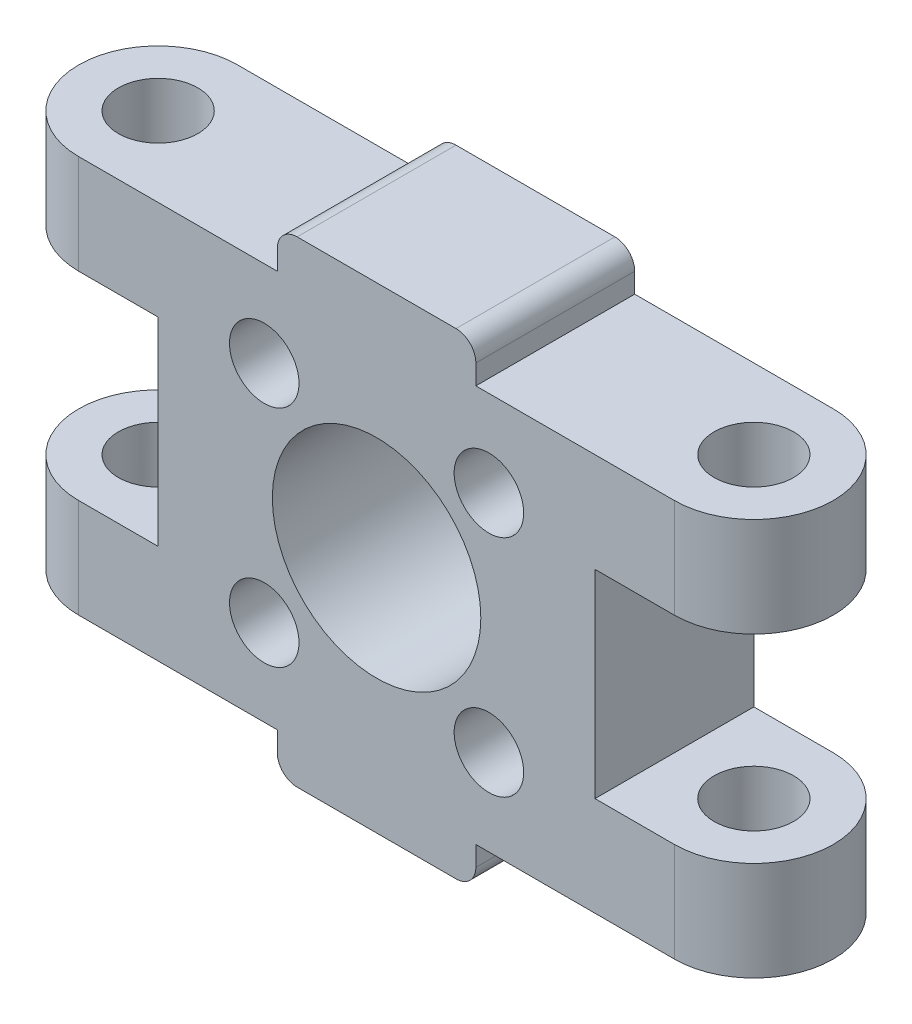
ISO-10303-21;
HEADER;
FILE_DESCRIPTION(('STEP AP214'),'2;1');
FILE_NAME('part.step','',(''),(''),'','','');
FILE_SCHEMA(('AUTOMOTIVE_DESIGN { 1 0 10303 214 1 1 1 1 }'));
ENDSEC;
DATA;
#1=APPLICATION_CONTEXT('core data for automotive mechanical design processes');
#2=APPLICATION_PROTOCOL_DEFINITION('international standard','automotive_design',2000,#1);
#3=PRODUCT_CONTEXT('',#1,'mechanical');
#4=PRODUCT('Part','Part','',(#3));
#5=PRODUCT_RELATED_PRODUCT_CATEGORY('part','',(#4));
#6=PRODUCT_DEFINITION_FORMATION('','',#4);
#7=PRODUCT_DEFINITION_CONTEXT('part definition',#1,'design');
#8=PRODUCT_DEFINITION('design','',#6,#7);
#9=PRODUCT_DEFINITION_SHAPE('','',#8);
#10=(LENGTH_UNIT() NAMED_UNIT(*) SI_UNIT(.MILLI.,.METRE.));
#11=(NAMED_UNIT(*) PLANE_ANGLE_UNIT() SI_UNIT($,.RADIAN.));
#12=(NAMED_UNIT(*) SI_UNIT($,.STERADIAN.) SOLID_ANGLE_UNIT());
#13=UNCERTAINTY_MEASURE_WITH_UNIT(LENGTH_MEASURE(1.E-05),#10,'distance_accuracy_value','');
#14=(GEOMETRIC_REPRESENTATION_CONTEXT(3) GLOBAL_UNCERTAINTY_ASSIGNED_CONTEXT((#13)) GLOBAL_UNIT_ASSIGNED_CONTEXT((#10,
#11,#12)) REPRESENTATION_CONTEXT('',''));
#15=CARTESIAN_POINT('',(0.,0.,0.));
#16=DIRECTION('',(0.,0.,1.));
#17=DIRECTION('',(1.,0.,0.));
#18=AXIS2_PLACEMENT_3D('',#15,#16,#17);
#19=CARTESIAN_POINT('',(15.,10.,3.99999999999999));
#20=DIRECTION('',(0.,0.,-1.));
#21=DIRECTION('',(-1.,0.,0.));
#22=AXIS2_PLACEMENT_3D('',#19,#20,#21);
#23=PLANE('',#22);
#24=CARTESIAN_POINT('',(5.65685424949235,-5.65685424949241,4.));
#25=DIRECTION('',(0.,0.,1.));
#26=DIRECTION('',(1.,0.,0.));
#27=AXIS2_PLACEMENT_3D('',#24,#25,#26);
#28=CIRCLE('',#27,1.75);
#29=CARTESIAN_POINT('',(7.40685424949235,-5.65685424949241,4.));
#30=VERTEX_POINT('',#29);
#31=EDGE_CURVE('E433',#30,#30,#28,.T.);
#32=ORIENTED_EDGE('',*,*,#31,.F.);
#33=EDGE_LOOP('',(#32));
#34=FACE_BOUND('',#33,.T.);
#35=CARTESIAN_POINT('',(-5.65685424949235,-5.65685424949241,4.));
#36=DIRECTION('',(0.,0.,1.));
#37=DIRECTION('',(1.,0.,0.));
#38=AXIS2_PLACEMENT_3D('',#35,#36,#37);
#39=CIRCLE('',#38,1.75);
#40=CARTESIAN_POINT('',(-3.90685424949235,-5.65685424949241,4.));
#41=VERTEX_POINT('',#40);
#42=EDGE_CURVE('E421',#41,#41,#39,.T.);
#43=ORIENTED_EDGE('',*,*,#42,.F.);
#44=EDGE_LOOP('',(#43));
#45=FACE_BOUND('',#44,.T.);
#46=DIRECTION('',(0.,-1.,0.));
#47=VECTOR('',#46,1.);
#48=CARTESIAN_POINT('',(-5.,-9.79795897113271,4.));
#49=LINE('',#48,#47);
#50=CARTESIAN_POINT('',(-5.,-10.,4.));
#51=VERTEX_POINT('',#50);
#52=CARTESIAN_POINT('',(-5.,-11.,4.));
#53=VERTEX_POINT('',#52);
#54=EDGE_CURVE('E234',#51,#53,#49,.T.);
#55=ORIENTED_EDGE('',*,*,#54,.T.);
#56=CARTESIAN_POINT('',(-4.,-11.,4.));
#57=DIRECTION('',(0.,0.,-1.));
#58=DIRECTION('',(-1.,0.,0.));
#59=AXIS2_PLACEMENT_3D('',#56,#57,#58);
#60=CIRCLE('',#59,1.);
#61=CARTESIAN_POINT('',(-4.,-12.,4.));
#62=VERTEX_POINT('',#61);
#63=EDGE_CURVE('E374',#53,#62,#60,.F.);
#64=ORIENTED_EDGE('',*,*,#63,.T.);
#65=DIRECTION('',(1.,0.,0.));
#66=VECTOR('',#65,1.);
#67=CARTESIAN_POINT('',(5.,-12.,4.));
#68=LINE('',#67,#66);
#69=CARTESIAN_POINT('',(4.,-12.,4.));
#70=VERTEX_POINT('',#69);
#71=EDGE_CURVE('E237',#62,#70,#68,.T.);
#72=ORIENTED_EDGE('',*,*,#71,.T.);
#73=CARTESIAN_POINT('',(4.,-11.,4.));
#74=DIRECTION('',(0.,0.,-1.));
#75=DIRECTION('',(-1.,0.,0.));
#76=AXIS2_PLACEMENT_3D('',#73,#74,#75);
#77=CIRCLE('',#76,1.);
#78=CARTESIAN_POINT('',(5.,-11.,4.));
#79=VERTEX_POINT('',#78);
#80=EDGE_CURVE('E372',#70,#79,#77,.F.);
#81=ORIENTED_EDGE('',*,*,#80,.T.);
#82=DIRECTION('',(0.,1.,0.));
#83=VECTOR('',#82,1.);
#84=CARTESIAN_POINT('',(5.,-9.79795897113271,4.));
#85=LINE('',#84,#83);
#86=CARTESIAN_POINT('',(5.,-10.,4.));
#87=VERTEX_POINT('',#86);
#88=EDGE_CURVE('E241',#79,#87,#85,.T.);
#89=ORIENTED_EDGE('',*,*,#88,.T.);
#90=DIRECTION('',(1.,0.,0.));
#91=VECTOR('',#90,1.);
#92=CARTESIAN_POINT('',(15.,-10.,3.99999999999999));
#93=LINE('',#92,#91);
#94=CARTESIAN_POINT('',(15.,-10.,3.99999999999999));
#95=VERTEX_POINT('',#94);
#96=EDGE_CURVE('E334',#87,#95,#93,.T.);
#97=ORIENTED_EDGE('',*,*,#96,.T.);
#98=DIRECTION('',(0.,-1.,0.));
#99=VECTOR('',#98,1.);
#100=CARTESIAN_POINT('',(15.,10.,3.99999999999999));
#101=LINE('',#100,#99);
#102=CARTESIAN_POINT('',(15.,-5.,4.));
#103=VERTEX_POINT('',#102);
#104=EDGE_CURVE('E349',#103,#95,#101,.T.);
#105=ORIENTED_EDGE('',*,*,#104,.F.);
#106=DIRECTION('',(1.,0.,0.));
#107=VECTOR('',#106,1.);
#108=CARTESIAN_POINT('',(19.,-5.,4.));
#109=LINE('',#108,#107);
#110=CARTESIAN_POINT('',(11.,-5.,4.));
#111=VERTEX_POINT('',#110);
#112=EDGE_CURVE('E270',#111,#103,#109,.T.);
#113=ORIENTED_EDGE('',*,*,#112,.F.);
#114=DIRECTION('',(0.,-1.,0.));
#115=VECTOR('',#114,1.);
#116=CARTESIAN_POINT('',(11.,5.,4.));
#117=LINE('',#116,#115);
#118=CARTESIAN_POINT('',(11.,5.,4.));
#119=VERTEX_POINT('',#118);
#120=EDGE_CURVE('E268',#119,#111,#117,.T.);
#121=ORIENTED_EDGE('',*,*,#120,.F.);
#122=DIRECTION('',(-1.,0.,0.));
#123=VECTOR('',#122,1.);
#124=CARTESIAN_POINT('',(19.,5.,4.));
#125=LINE('',#124,#123);
#126=CARTESIAN_POINT('',(15.,5.,4.));
#127=VERTEX_POINT('',#126);
#128=EDGE_CURVE('E220',#127,#119,#125,.T.);
#129=ORIENTED_EDGE('',*,*,#128,.F.);
#130=CARTESIAN_POINT('',(15.,10.,3.99999999999999));
#131=VERTEX_POINT('',#130);
#132=EDGE_CURVE('E350',#131,#127,#101,.T.);
#133=ORIENTED_EDGE('',*,*,#132,.F.);
#134=DIRECTION('',(1.,0.,0.));
#135=VECTOR('',#134,1.);
#136=CARTESIAN_POINT('',(15.,10.,3.99999999999999));
#137=LINE('',#136,#135);
#138=CARTESIAN_POINT('',(5.,10.,4.));
#139=VERTEX_POINT('',#138);
#140=EDGE_CURVE('E326',#139,#131,#137,.T.);
#141=ORIENTED_EDGE('',*,*,#140,.F.);
#142=DIRECTION('',(0.,1.,0.));
#143=VECTOR('',#142,1.);
#144=CARTESIAN_POINT('',(5.,12.,4.));
#145=LINE('',#144,#143);
#146=CARTESIAN_POINT('',(5.,11.,4.));
#147=VERTEX_POINT('',#146);
#148=EDGE_CURVE('E243',#139,#147,#145,.T.);
#149=ORIENTED_EDGE('',*,*,#148,.T.);
#150=CARTESIAN_POINT('',(4.,11.,4.));
#151=DIRECTION('',(0.,0.,-1.));
#152=DIRECTION('',(-1.,0.,0.));
#153=AXIS2_PLACEMENT_3D('',#150,#151,#152);
#154=CIRCLE('',#153,1.);
#155=CARTESIAN_POINT('',(4.,12.,4.));
#156=VERTEX_POINT('',#155);
#157=EDGE_CURVE('E368',#147,#156,#154,.F.);
#158=ORIENTED_EDGE('',*,*,#157,.T.);
#159=DIRECTION('',(-1.,0.,0.));
#160=VECTOR('',#159,1.);
#161=CARTESIAN_POINT('',(5.,12.,4.));
#162=LINE('',#161,#160);
#163=CARTESIAN_POINT('',(-4.,12.,4.));
#164=VERTEX_POINT('',#163);
#165=EDGE_CURVE('E246',#156,#164,#162,.T.);
#166=ORIENTED_EDGE('',*,*,#165,.T.);
#167=CARTESIAN_POINT('',(-4.,11.,4.));
#168=DIRECTION('',(0.,0.,-1.));
#169=DIRECTION('',(-1.,0.,0.));
#170=AXIS2_PLACEMENT_3D('',#167,#168,#169);
#171=CIRCLE('',#170,1.);
#172=CARTESIAN_POINT('',(-5.,11.,4.));
#173=VERTEX_POINT('',#172);
#174=EDGE_CURVE('E370',#164,#173,#171,.F.);
#175=ORIENTED_EDGE('',*,*,#174,.T.);
#176=DIRECTION('',(0.,-1.,0.));
#177=VECTOR('',#176,1.);
#178=CARTESIAN_POINT('',(-5.,12.,4.));
#179=LINE('',#178,#177);
#180=CARTESIAN_POINT('',(-5.,10.,4.));
#181=VERTEX_POINT('',#180);
#182=EDGE_CURVE('E249',#173,#181,#179,.T.);
#183=ORIENTED_EDGE('',*,*,#182,.T.);
#184=CARTESIAN_POINT('',(-15.,10.,4.));
#185=VERTEX_POINT('',#184);
#186=EDGE_CURVE('E217',#185,#181,#137,.T.);
#187=ORIENTED_EDGE('',*,*,#186,.F.);
#188=DIRECTION('',(0.,-1.,0.));
#189=VECTOR('',#188,1.);
#190=CARTESIAN_POINT('',(-15.,10.,4.));
#191=LINE('',#190,#189);
#192=CARTESIAN_POINT('',(-15.,5.,4.));
#193=VERTEX_POINT('',#192);
#194=EDGE_CURVE('E354',#185,#193,#191,.T.);
#195=ORIENTED_EDGE('',*,*,#194,.T.);
#196=DIRECTION('',(-1.,0.,0.));
#197=VECTOR('',#196,1.);
#198=CARTESIAN_POINT('',(-19.,5.,4.));
#199=LINE('',#198,#197);
#200=CARTESIAN_POINT('',(-11.,5.,4.));
#201=VERTEX_POINT('',#200);
#202=EDGE_CURVE('E295',#201,#193,#199,.T.);
#203=ORIENTED_EDGE('',*,*,#202,.F.);
#204=DIRECTION('',(0.,1.,0.));
#205=VECTOR('',#204,1.);
#206=CARTESIAN_POINT('',(-11.,5.,4.));
#207=LINE('',#206,#205);
#208=CARTESIAN_POINT('',(-11.,-5.,4.));
#209=VERTEX_POINT('',#208);
#210=EDGE_CURVE('E293',#209,#201,#207,.T.);
#211=ORIENTED_EDGE('',*,*,#210,.F.);
#212=DIRECTION('',(1.,0.,0.));
#213=VECTOR('',#212,1.);
#214=CARTESIAN_POINT('',(-19.,-5.,4.));
#215=LINE('',#214,#213);
#216=CARTESIAN_POINT('',(-15.,-5.,4.));
#217=VERTEX_POINT('',#216);
#218=EDGE_CURVE('E285',#217,#209,#215,.T.);
#219=ORIENTED_EDGE('',*,*,#218,.F.);
#220=CARTESIAN_POINT('',(-15.,-10.,4.));
#221=VERTEX_POINT('',#220);
#222=EDGE_CURVE('E353',#217,#221,#191,.T.);
#223=ORIENTED_EDGE('',*,*,#222,.T.);
#224=EDGE_CURVE('E335',#221,#51,#93,.T.);
#225=ORIENTED_EDGE('',*,*,#224,.T.);
#226=EDGE_LOOP('',(#55,#64,#72,#81,#89,#97,#105,#113,#121,#129,#133,#141,#149,#158,#166,#175,
#183,#187,#195,#203,#211,#219,#223,#225));
#227=FACE_BOUND('',#226,.T.);
#228=CARTESIAN_POINT('',(0.,0.,4.));
#229=DIRECTION('',(0.,0.,1.));
#230=DIRECTION('',(1.,0.,0.));
#231=AXIS2_PLACEMENT_3D('',#228,#229,#230);
#232=CIRCLE('',#231,5.24999999999999);
#233=CARTESIAN_POINT('',(5.24999999999999,0.,4.));
#234=VERTEX_POINT('',#233);
#235=EDGE_CURVE('E415',#234,#234,#232,.T.);
#236=ORIENTED_EDGE('',*,*,#235,.F.);
#237=EDGE_LOOP('',(#236));
#238=FACE_BOUND('',#237,.T.);
#239=CARTESIAN_POINT('',(-5.65685424949235,5.65685424949241,4.));
#240=DIRECTION('',(0.,0.,1.));
#241=DIRECTION('',(1.,0.,0.));
#242=AXIS2_PLACEMENT_3D('',#239,#240,#241);
#243=CIRCLE('',#242,1.75);
#244=CARTESIAN_POINT('',(-3.90685424949235,5.65685424949241,4.));
#245=VERTEX_POINT('',#244);
#246=EDGE_CURVE('E427',#245,#245,#243,.T.);
#247=ORIENTED_EDGE('',*,*,#246,.F.);
#248=EDGE_LOOP('',(#247));
#249=FACE_BOUND('',#248,.T.);
#250=CARTESIAN_POINT('',(5.65685424949235,5.65685424949241,4.));
#251=DIRECTION('',(0.,0.,1.));
#252=DIRECTION('',(1.,0.,0.));
#253=AXIS2_PLACEMENT_3D('',#250,#251,#252);
#254=CIRCLE('',#253,1.75);
#255=CARTESIAN_POINT('',(7.40685424949235,5.65685424949241,4.));
#256=VERTEX_POINT('',#255);
#257=EDGE_CURVE('E439',#256,#256,#254,.T.);
#258=ORIENTED_EDGE('',*,*,#257,.F.);
#259=EDGE_LOOP('',(#258));
#260=FACE_BOUND('',#259,.T.);
#261=ADVANCED_FACE('F34',(#34,#45,#227,#238,#249,#260),#23,.F.);
#262=CARTESIAN_POINT('',(-15.,10.,0.));
#263=DIRECTION('',(0.,1.,0.));
#264=DIRECTION('',(0.,0.,1.));
#265=AXIS2_PLACEMENT_3D('',#262,#263,#264);
#266=PLANE('',#265);
#267=DIRECTION('',(0.,0.,1.));
#268=VECTOR('',#267,1.);
#269=CARTESIAN_POINT('',(-5.,10.,0.));
#270=LINE('',#269,#268);
#271=CARTESIAN_POINT('',(-5.,10.,-4.));
#272=VERTEX_POINT('',#271);
#273=EDGE_CURVE('E214',#272,#181,#270,.T.);
#274=ORIENTED_EDGE('',*,*,#273,.F.);
#275=DIRECTION('',(-1.,0.,0.));
#276=VECTOR('',#275,1.);
#277=CARTESIAN_POINT('',(15.,10.,-4.00000000000001));
#278=LINE('',#277,#276);
#279=CARTESIAN_POINT('',(-15.,10.,-4.));
#280=VERTEX_POINT('',#279);
#281=EDGE_CURVE('E196',#272,#280,#278,.T.);
#282=ORIENTED_EDGE('',*,*,#281,.T.);
#283=CARTESIAN_POINT('',(-15.,10.,0.));
#284=DIRECTION('',(0.,1.,0.));
#285=DIRECTION('',(0.,0.,1.));
#286=AXIS2_PLACEMENT_3D('',#283,#284,#285);
#287=CIRCLE('',#286,4.);
#288=EDGE_CURVE('E324',#280,#185,#287,.T.);
#289=ORIENTED_EDGE('',*,*,#288,.T.);
#290=ORIENTED_EDGE('',*,*,#186,.T.);
#291=EDGE_LOOP('',(#274,#282,#289,#290));
#292=FACE_BOUND('',#291,.T.);
#293=CARTESIAN_POINT('',(-15.,10.,0.));
#294=DIRECTION('',(0.,1.,0.));
#295=DIRECTION('',(0.,0.,1.));
#296=AXIS2_PLACEMENT_3D('',#293,#294,#295);
#297=CIRCLE('',#296,2.);
#298=CARTESIAN_POINT('',(-15.,10.,2.));
#299=VERTEX_POINT('',#298);
#300=EDGE_CURVE('E318',#299,#299,#297,.T.);
#301=ORIENTED_EDGE('',*,*,#300,.F.);
#302=EDGE_LOOP('',(#301));
#303=FACE_BOUND('',#302,.T.);
#304=ADVANCED_FACE('F215',(#292,#303),#266,.T.);
#305=CARTESIAN_POINT('',(-15.,-10.,0.));
#306=DIRECTION('',(0.,1.,0.));
#307=DIRECTION('',(0.,0.,1.));
#308=AXIS2_PLACEMENT_3D('',#305,#306,#307);
#309=PLANE('',#308);
#310=CARTESIAN_POINT('',(15.,-10.,0.));
#311=DIRECTION('',(0.,1.,0.));
#312=DIRECTION('',(0.,0.,1.));
#313=AXIS2_PLACEMENT_3D('',#310,#311,#312);
#314=CIRCLE('',#313,2.);
#315=CARTESIAN_POINT('',(15.,-10.,1.99999999999999));
#316=VERTEX_POINT('',#315);
#317=EDGE_CURVE('E311',#316,#316,#314,.T.);
#318=ORIENTED_EDGE('',*,*,#317,.T.);
#319=EDGE_LOOP('',(#318));
#320=FACE_BOUND('',#319,.T.);
#321=ORIENTED_EDGE('',*,*,#96,.F.);
#322=DIRECTION('',(0.,0.,-1.));
#323=VECTOR('',#322,1.);
#324=CARTESIAN_POINT('',(5.,-10.,0.));
#325=LINE('',#324,#323);
#326=CARTESIAN_POINT('',(5.,-10.,-4.));
#327=VERTEX_POINT('',#326);
#328=EDGE_CURVE('E254',#87,#327,#325,.T.);
#329=ORIENTED_EDGE('',*,*,#328,.T.);
#330=DIRECTION('',(-1.,0.,0.));
#331=VECTOR('',#330,1.);
#332=CARTESIAN_POINT('',(15.,-10.,-4.00000000000001));
#333=LINE('',#332,#331);
#334=CARTESIAN_POINT('',(15.,-10.,-4.00000000000001));
#335=VERTEX_POINT('',#334);
#336=EDGE_CURVE('E327',#335,#327,#333,.T.);
#337=ORIENTED_EDGE('',*,*,#336,.F.);
#338=CARTESIAN_POINT('',(15.,-10.,0.));
#339=DIRECTION('',(0.,1.,0.));
#340=DIRECTION('',(0.,0.,1.));
#341=AXIS2_PLACEMENT_3D('',#338,#339,#340);
#342=CIRCLE('',#341,4.);
#343=EDGE_CURVE('E338',#95,#335,#342,.T.);
#344=ORIENTED_EDGE('',*,*,#343,.F.);
#345=EDGE_LOOP('',(#321,#329,#337,#344));
#346=FACE_BOUND('',#345,.T.);
#347=ADVANCED_FACE('F451',(#320,#346),#309,.F.);
#348=CARTESIAN_POINT('',(15.,10.,0.));
#349=DIRECTION('',(0.,-1.,0.));
#350=DIRECTION('',(0.,0.,-1.));
#351=AXIS2_PLACEMENT_3D('',#348,#349,#350);
#352=CYLINDRICAL_SURFACE('',#351,4.);
#353=ORIENTED_EDGE('',*,*,#132,.T.);
#354=CARTESIAN_POINT('',(15.,5.,0.));
#355=DIRECTION('',(0.,1.,0.));
#356=DIRECTION('',(-1.,0.,0.));
#357=AXIS2_PLACEMENT_3D('',#354,#355,#356);
#358=CIRCLE('',#357,4.);
#359=CARTESIAN_POINT('',(15.,5.,-4.));
#360=VERTEX_POINT('',#359);
#361=EDGE_CURVE('E283',#127,#360,#358,.T.);
#362=ORIENTED_EDGE('',*,*,#361,.T.);
#363=DIRECTION('',(0.,-1.,0.));
#364=VECTOR('',#363,1.);
#365=CARTESIAN_POINT('',(15.,10.,-4.00000000000001));
#366=LINE('',#365,#364);
#367=CARTESIAN_POINT('',(15.,10.,-4.00000000000001));
#368=VERTEX_POINT('',#367);
#369=EDGE_CURVE('E346',#368,#360,#366,.T.);
#370=ORIENTED_EDGE('',*,*,#369,.F.);
#371=CARTESIAN_POINT('',(15.,10.,0.));
#372=DIRECTION('',(0.,1.,0.));
#373=DIRECTION('',(0.,0.,1.));
#374=AXIS2_PLACEMENT_3D('',#371,#372,#373);
#375=CIRCLE('',#374,4.);
#376=EDGE_CURVE('E210',#131,#368,#375,.T.);
#377=ORIENTED_EDGE('',*,*,#376,.F.);
#378=EDGE_LOOP('',(#353,#362,#370,#377));
#379=FACE_BOUND('',#378,.T.);
#380=ADVANCED_FACE('F674',(#379),#352,.T.);
#381=CARTESIAN_POINT('',(15.,10.,0.));
#382=DIRECTION('',(0.,-1.,0.));
#383=DIRECTION('',(0.,0.,-1.));
#384=AXIS2_PLACEMENT_3D('',#381,#382,#383);
#385=CYLINDRICAL_SURFACE('',#384,2.);
#386=CARTESIAN_POINT('',(15.,5.,0.));
#387=DIRECTION('',(0.,1.,0.));
#388=DIRECTION('',(-1.,0.,0.));
#389=AXIS2_PLACEMENT_3D('',#386,#387,#388);
#390=CIRCLE('',#389,2.);
#391=CARTESIAN_POINT('',(13.,5.,0.));
#392=VERTEX_POINT('',#391);
#393=EDGE_CURVE('E282',#392,#392,#390,.T.);
#394=ORIENTED_EDGE('',*,*,#393,.F.);
#395=EDGE_LOOP('',(#394));
#396=FACE_BOUND('',#395,.T.);
#397=CARTESIAN_POINT('',(15.,10.,0.));
#398=DIRECTION('',(0.,1.,0.));
#399=DIRECTION('',(0.,0.,1.));
#400=AXIS2_PLACEMENT_3D('',#397,#398,#399);
#401=CIRCLE('',#400,2.);
#402=CARTESIAN_POINT('',(15.,10.,1.99999999999999));
#403=VERTEX_POINT('',#402);
#404=EDGE_CURVE('E312',#403,#403,#401,.T.);
#405=ORIENTED_EDGE('',*,*,#404,.T.);
#406=EDGE_LOOP('',(#405));
#407=FACE_BOUND('',#406,.T.);
#408=ADVANCED_FACE('F724',(#396,#407),#385,.F.);
#409=CARTESIAN_POINT('',(-15.,10.,0.));
#410=DIRECTION('',(0.,-1.,0.));
#411=DIRECTION('',(0.,0.,-1.));
#412=AXIS2_PLACEMENT_3D('',#409,#410,#411);
#413=CYLINDRICAL_SURFACE('',#412,4.);
#414=DIRECTION('',(0.,-1.,0.));
#415=VECTOR('',#414,1.);
#416=CARTESIAN_POINT('',(-15.,10.,-4.));
#417=LINE('',#416,#415);
#418=CARTESIAN_POINT('',(-15.,5.,-4.));
#419=VERTEX_POINT('',#418);
#420=EDGE_CURVE('E205',#280,#419,#417,.T.);
#421=ORIENTED_EDGE('',*,*,#420,.T.);
#422=CARTESIAN_POINT('',(-15.,5.,0.));
#423=DIRECTION('',(0.,1.,0.));
#424=DIRECTION('',(0.,0.,1.));
#425=AXIS2_PLACEMENT_3D('',#422,#423,#424);
#426=CIRCLE('',#425,4.);
#427=EDGE_CURVE('E309',#419,#193,#426,.T.);
#428=ORIENTED_EDGE('',*,*,#427,.T.);
#429=ORIENTED_EDGE('',*,*,#194,.F.);
#430=ORIENTED_EDGE('',*,*,#288,.F.);
#431=EDGE_LOOP('',(#421,#428,#429,#430));
#432=FACE_BOUND('',#431,.T.);
#433=ADVANCED_FACE('F465',(#432),#413,.T.);
#434=CARTESIAN_POINT('',(-15.,10.,0.));
#435=DIRECTION('',(0.,-1.,0.));
#436=DIRECTION('',(0.,0.,-1.));
#437=AXIS2_PLACEMENT_3D('',#434,#435,#436);
#438=CYLINDRICAL_SURFACE('',#437,2.);
#439=CARTESIAN_POINT('',(-15.,5.,0.));
#440=DIRECTION('',(0.,1.,0.));
#441=DIRECTION('',(0.,0.,1.));
#442=AXIS2_PLACEMENT_3D('',#439,#440,#441);
#443=CIRCLE('',#442,2.);
#444=CARTESIAN_POINT('',(-15.,5.,2.));
#445=VERTEX_POINT('',#444);
#446=EDGE_CURVE('E308',#445,#445,#443,.T.);
#447=ORIENTED_EDGE('',*,*,#446,.F.);
#448=EDGE_LOOP('',(#447));
#449=FACE_BOUND('',#448,.T.);
#450=ORIENTED_EDGE('',*,*,#300,.T.);
#451=EDGE_LOOP('',(#450));
#452=FACE_BOUND('',#451,.T.);
#453=ADVANCED_FACE('F665',(#449,#452),#438,.F.);
#454=DIRECTION('',(0.,0.,-1.));
#455=VECTOR('',#454,1.);
#456=CARTESIAN_POINT('',(5.,10.,0.));
#457=LINE('',#456,#455);
#458=CARTESIAN_POINT('',(5.,10.,-4.));
#459=VERTEX_POINT('',#458);
#460=EDGE_CURVE('E221',#139,#459,#457,.T.);
#461=ORIENTED_EDGE('',*,*,#460,.F.);
#462=ORIENTED_EDGE('',*,*,#140,.T.);
#463=ORIENTED_EDGE('',*,*,#376,.T.);
#464=EDGE_CURVE('E209',#368,#459,#278,.T.);
#465=ORIENTED_EDGE('',*,*,#464,.T.);
#466=EDGE_LOOP('',(#461,#462,#463,#465));
#467=FACE_BOUND('',#466,.T.);
#468=ORIENTED_EDGE('',*,*,#404,.F.);
#469=EDGE_LOOP('',(#468));
#470=FACE_BOUND('',#469,.T.);
#471=ADVANCED_FACE('F453',(#467,#470),#266,.T.);
#472=CARTESIAN_POINT('',(-15.,-10.,0.));
#473=DIRECTION('',(0.,1.,0.));
#474=DIRECTION('',(0.,0.,1.));
#475=AXIS2_PLACEMENT_3D('',#472,#473,#474);
#476=CIRCLE('',#475,2.);
#477=CARTESIAN_POINT('',(-15.,-10.,2.));
#478=VERTEX_POINT('',#477);
#479=EDGE_CURVE('E315',#478,#478,#476,.T.);
#480=ORIENTED_EDGE('',*,*,#479,.T.);
#481=EDGE_LOOP('',(#480));
#482=FACE_BOUND('',#481,.T.);
#483=CARTESIAN_POINT('',(-5.,-10.,-4.));
#484=VERTEX_POINT('',#483);
#485=CARTESIAN_POINT('',(-15.,-10.,-4.));
#486=VERTEX_POINT('',#485);
#487=EDGE_CURVE('E341',#484,#486,#333,.T.);
#488=ORIENTED_EDGE('',*,*,#487,.F.);
#489=DIRECTION('',(0.,0.,1.));
#490=VECTOR('',#489,1.);
#491=CARTESIAN_POINT('',(-5.,-10.,0.));
#492=LINE('',#491,#490);
#493=EDGE_CURVE('E228',#484,#51,#492,.T.);
#494=ORIENTED_EDGE('',*,*,#493,.T.);
#495=ORIENTED_EDGE('',*,*,#224,.F.);
#496=CARTESIAN_POINT('',(-15.,-10.,0.));
#497=DIRECTION('',(0.,1.,0.));
#498=DIRECTION('',(0.,0.,1.));
#499=AXIS2_PLACEMENT_3D('',#496,#497,#498);
#500=CIRCLE('',#499,4.);
#501=EDGE_CURVE('E321',#486,#221,#500,.T.);
#502=ORIENTED_EDGE('',*,*,#501,.F.);
#503=EDGE_LOOP('',(#488,#494,#495,#502));
#504=FACE_BOUND('',#503,.T.);
#505=ADVANCED_FACE('F463',(#482,#504),#309,.F.);
#506=ORIENTED_EDGE('',*,*,#222,.F.);
#507=CARTESIAN_POINT('',(-15.,-5.,0.));
#508=DIRECTION('',(0.,-1.,0.));
#509=DIRECTION('',(0.,0.,-1.));
#510=AXIS2_PLACEMENT_3D('',#507,#508,#509);
#511=CIRCLE('',#510,4.);
#512=CARTESIAN_POINT('',(-15.,-5.,-4.));
#513=VERTEX_POINT('',#512);
#514=EDGE_CURVE('E306',#217,#513,#511,.T.);
#515=ORIENTED_EDGE('',*,*,#514,.T.);
#516=EDGE_CURVE('E331',#513,#486,#417,.T.);
#517=ORIENTED_EDGE('',*,*,#516,.T.);
#518=ORIENTED_EDGE('',*,*,#501,.T.);
#519=EDGE_LOOP('',(#506,#515,#517,#518));
#520=FACE_BOUND('',#519,.T.);
#521=ADVANCED_FACE('F460',(#520),#413,.T.);
#522=CARTESIAN_POINT('',(15.,-5.,0.));
#523=DIRECTION('',(0.,-1.,0.));
#524=DIRECTION('',(1.,0.,0.));
#525=AXIS2_PLACEMENT_3D('',#522,#523,#524);
#526=CIRCLE('',#525,4.);
#527=CARTESIAN_POINT('',(15.,-5.,-4.));
#528=VERTEX_POINT('',#527);
#529=EDGE_CURVE('E280',#528,#103,#526,.T.);
#530=ORIENTED_EDGE('',*,*,#529,.T.);
#531=ORIENTED_EDGE('',*,*,#104,.T.);
#532=ORIENTED_EDGE('',*,*,#343,.T.);
#533=EDGE_CURVE('E345',#528,#335,#366,.T.);
#534=ORIENTED_EDGE('',*,*,#533,.F.);
#535=EDGE_LOOP('',(#530,#531,#532,#534));
#536=FACE_BOUND('',#535,.T.);
#537=ADVANCED_FACE('F458',(#536),#352,.T.);
#538=CARTESIAN_POINT('',(15.,10.,-4.00000000000001));
#539=DIRECTION('',(0.,0.,1.));
#540=DIRECTION('',(1.,0.,0.));
#541=AXIS2_PLACEMENT_3D('',#538,#539,#540);
#542=PLANE('',#541);
#543=CARTESIAN_POINT('',(5.65685424949235,5.65685424949241,-4.));
#544=DIRECTION('',(0.,0.,1.));
#545=DIRECTION('',(1.,0.,0.));
#546=AXIS2_PLACEMENT_3D('',#543,#544,#545);
#547=CIRCLE('',#546,1.75);
#548=CARTESIAN_POINT('',(7.40685424949235,5.65685424949241,-4.));
#549=VERTEX_POINT('',#548);
#550=EDGE_CURVE('E436',#549,#549,#547,.T.);
#551=ORIENTED_EDGE('',*,*,#550,.T.);
#552=EDGE_LOOP('',(#551));
#553=FACE_BOUND('',#552,.T.);
#554=CARTESIAN_POINT('',(5.65685424949235,-5.65685424949241,-4.));
#555=DIRECTION('',(0.,0.,1.));
#556=DIRECTION('',(1.,0.,0.));
#557=AXIS2_PLACEMENT_3D('',#554,#555,#556);
#558=CIRCLE('',#557,1.75);
#559=CARTESIAN_POINT('',(7.40685424949235,-5.65685424949241,-4.));
#560=VERTEX_POINT('',#559);
#561=EDGE_CURVE('E430',#560,#560,#558,.T.);
#562=ORIENTED_EDGE('',*,*,#561,.T.);
#563=EDGE_LOOP('',(#562));
#564=FACE_BOUND('',#563,.T.);
#565=CARTESIAN_POINT('',(-5.65685424949235,5.65685424949241,-4.));
#566=DIRECTION('',(0.,0.,1.));
#567=DIRECTION('',(1.,0.,0.));
#568=AXIS2_PLACEMENT_3D('',#565,#566,#567);
#569=CIRCLE('',#568,1.75);
#570=CARTESIAN_POINT('',(-3.90685424949235,5.65685424949241,-4.));
#571=VERTEX_POINT('',#570);
#572=EDGE_CURVE('E424',#571,#571,#569,.T.);
#573=ORIENTED_EDGE('',*,*,#572,.T.);
#574=EDGE_LOOP('',(#573));
#575=FACE_BOUND('',#574,.T.);
#576=CARTESIAN_POINT('',(-5.65685424949235,-5.65685424949241,-4.));
#577=DIRECTION('',(0.,0.,1.));
#578=DIRECTION('',(1.,0.,0.));
#579=AXIS2_PLACEMENT_3D('',#576,#577,#578);
#580=CIRCLE('',#579,1.75);
#581=CARTESIAN_POINT('',(-3.90685424949235,-5.65685424949241,-4.));
#582=VERTEX_POINT('',#581);
#583=EDGE_CURVE('E418',#582,#582,#580,.T.);
#584=ORIENTED_EDGE('',*,*,#583,.T.);
#585=EDGE_LOOP('',(#584));
#586=FACE_BOUND('',#585,.T.);
#587=CARTESIAN_POINT('',(0.,0.,-4.));
#588=DIRECTION('',(0.,0.,1.));
#589=DIRECTION('',(1.,0.,0.));
#590=AXIS2_PLACEMENT_3D('',#587,#588,#589);
#591=CIRCLE('',#590,5.24999999999999);
#592=CARTESIAN_POINT('',(5.24999999999999,0.,-4.));
#593=VERTEX_POINT('',#592);
#594=EDGE_CURVE('E238',#593,#593,#591,.T.);
#595=ORIENTED_EDGE('',*,*,#594,.T.);
#596=EDGE_LOOP('',(#595));
#597=FACE_BOUND('',#596,.T.);
#598=DIRECTION('',(-1.,0.,0.));
#599=VECTOR('',#598,1.);
#600=CARTESIAN_POINT('',(5.00000000000001,-12.,-4.));
#601=LINE('',#600,#599);
#602=CARTESIAN_POINT('',(4.,-12.,-4.));
#603=VERTEX_POINT('',#602);
#604=CARTESIAN_POINT('',(-4.,-12.,-4.));
#605=VERTEX_POINT('',#604);
#606=EDGE_CURVE('E250',#603,#605,#601,.T.);
#607=ORIENTED_EDGE('',*,*,#606,.T.);
#608=CARTESIAN_POINT('',(-4.,-11.,-4.));
#609=DIRECTION('',(0.,0.,1.));
#610=DIRECTION('',(1.,0.,0.));
#611=AXIS2_PLACEMENT_3D('',#608,#609,#610);
#612=CIRCLE('',#611,1.);
#613=CARTESIAN_POINT('',(-5.,-11.,-4.));
#614=VERTEX_POINT('',#613);
#615=EDGE_CURVE('E386',#605,#614,#612,.F.);
#616=ORIENTED_EDGE('',*,*,#615,.T.);
#617=DIRECTION('',(0.,1.,0.));
#618=VECTOR('',#617,1.);
#619=CARTESIAN_POINT('',(-5.,-9.79795897113271,-4.));
#620=LINE('',#619,#618);
#621=EDGE_CURVE('E225',#614,#484,#620,.T.);
#622=ORIENTED_EDGE('',*,*,#621,.T.);
#623=ORIENTED_EDGE('',*,*,#487,.T.);
#624=ORIENTED_EDGE('',*,*,#516,.F.);
#625=DIRECTION('',(-1.,0.,0.));
#626=VECTOR('',#625,1.);
#627=CARTESIAN_POINT('',(-19.,-5.,-4.));
#628=LINE('',#627,#626);
#629=CARTESIAN_POINT('',(-11.,-5.,-4.));
#630=VERTEX_POINT('',#629);
#631=EDGE_CURVE('E291',#630,#513,#628,.T.);
#632=ORIENTED_EDGE('',*,*,#631,.F.);
#633=DIRECTION('',(0.,-1.,0.));
#634=VECTOR('',#633,1.);
#635=CARTESIAN_POINT('',(-11.,5.,-4.));
#636=LINE('',#635,#634);
#637=CARTESIAN_POINT('',(-11.,5.,-4.));
#638=VERTEX_POINT('',#637);
#639=EDGE_CURVE('E286',#638,#630,#636,.T.);
#640=ORIENTED_EDGE('',*,*,#639,.F.);
#641=DIRECTION('',(1.,0.,0.));
#642=VECTOR('',#641,1.);
#643=CARTESIAN_POINT('',(-19.,5.,-4.));
#644=LINE('',#643,#642);
#645=EDGE_CURVE('E288',#419,#638,#644,.T.);
#646=ORIENTED_EDGE('',*,*,#645,.F.);
#647=ORIENTED_EDGE('',*,*,#420,.F.);
#648=ORIENTED_EDGE('',*,*,#281,.F.);
#649=DIRECTION('',(0.,1.,0.));
#650=VECTOR('',#649,1.);
#651=CARTESIAN_POINT('',(-5.,12.,-4.));
#652=LINE('',#651,#650);
#653=CARTESIAN_POINT('',(-5.,11.,-4.));
#654=VERTEX_POINT('',#653);
#655=EDGE_CURVE('E201',#272,#654,#652,.T.);
#656=ORIENTED_EDGE('',*,*,#655,.T.);
#657=CARTESIAN_POINT('',(-4.,11.,-4.));
#658=DIRECTION('',(0.,0.,1.));
#659=DIRECTION('',(1.,0.,0.));
#660=AXIS2_PLACEMENT_3D('',#657,#658,#659);
#661=CIRCLE('',#660,1.);
#662=CARTESIAN_POINT('',(-4.,12.,-4.));
#663=VERTEX_POINT('',#662);
#664=EDGE_CURVE('E382',#654,#663,#661,.F.);
#665=ORIENTED_EDGE('',*,*,#664,.T.);
#666=DIRECTION('',(1.,0.,0.));
#667=VECTOR('',#666,1.);
#668=CARTESIAN_POINT('',(5.,12.,-4.));
#669=LINE('',#668,#667);
#670=CARTESIAN_POINT('',(4.,12.,-4.));
#671=VERTEX_POINT('',#670);
#672=EDGE_CURVE('E226',#663,#671,#669,.T.);
#673=ORIENTED_EDGE('',*,*,#672,.T.);
#674=CARTESIAN_POINT('',(4.,11.,-4.));
#675=DIRECTION('',(0.,0.,1.));
#676=DIRECTION('',(1.,0.,0.));
#677=AXIS2_PLACEMENT_3D('',#674,#675,#676);
#678=CIRCLE('',#677,1.);
#679=CARTESIAN_POINT('',(5.,11.,-4.));
#680=VERTEX_POINT('',#679);
#681=EDGE_CURVE('E57',#671,#680,#678,.F.);
#682=ORIENTED_EDGE('',*,*,#681,.T.);
#683=DIRECTION('',(0.,-1.,0.));
#684=VECTOR('',#683,1.);
#685=CARTESIAN_POINT('',(5.,12.,-4.));
#686=LINE('',#685,#684);
#687=EDGE_CURVE('E230',#680,#459,#686,.T.);
#688=ORIENTED_EDGE('',*,*,#687,.T.);
#689=ORIENTED_EDGE('',*,*,#464,.F.);
#690=ORIENTED_EDGE('',*,*,#369,.T.);
#691=DIRECTION('',(1.,0.,0.));
#692=VECTOR('',#691,1.);
#693=CARTESIAN_POINT('',(19.,5.,-4.00000000000001));
#694=LINE('',#693,#692);
#695=CARTESIAN_POINT('',(11.,5.,-4.00000000000001));
#696=VERTEX_POINT('',#695);
#697=EDGE_CURVE('E262',#696,#360,#694,.T.);
#698=ORIENTED_EDGE('',*,*,#697,.F.);
#699=DIRECTION('',(0.,1.,0.));
#700=VECTOR('',#699,1.);
#701=CARTESIAN_POINT('',(11.,5.,-4.00000000000001));
#702=LINE('',#701,#700);
#703=CARTESIAN_POINT('',(11.,-5.,-4.));
#704=VERTEX_POINT('',#703);
#705=EDGE_CURVE('E266',#704,#696,#702,.T.);
#706=ORIENTED_EDGE('',*,*,#705,.F.);
#707=DIRECTION('',(-1.,0.,0.));
#708=VECTOR('',#707,1.);
#709=CARTESIAN_POINT('',(19.,-5.,-4.00000000000001));
#710=LINE('',#709,#708);
#711=EDGE_CURVE('E259',#528,#704,#710,.T.);
#712=ORIENTED_EDGE('',*,*,#711,.F.);
#713=ORIENTED_EDGE('',*,*,#533,.T.);
#714=ORIENTED_EDGE('',*,*,#336,.T.);
#715=DIRECTION('',(0.,-1.,0.));
#716=VECTOR('',#715,1.);
#717=CARTESIAN_POINT('',(5.,-9.79795897113271,-4.));
#718=LINE('',#717,#716);
#719=CARTESIAN_POINT('',(5.,-11.,-4.));
#720=VERTEX_POINT('',#719);
#721=EDGE_CURVE('E409',#327,#720,#718,.T.);
#722=ORIENTED_EDGE('',*,*,#721,.T.);
#723=CARTESIAN_POINT('',(4.,-11.,-4.));
#724=DIRECTION('',(0.,0.,1.));
#725=DIRECTION('',(1.,0.,0.));
#726=AXIS2_PLACEMENT_3D('',#723,#724,#725);
#727=CIRCLE('',#726,1.);
#728=EDGE_CURVE('E384',#720,#603,#727,.F.);
#729=ORIENTED_EDGE('',*,*,#728,.T.);
#730=EDGE_LOOP('',(#607,#616,#622,#623,#624,#632,#640,#646,#647,#648,#656,#665,#673,#682,#688,
#689,#690,#698,#706,#712,#713,#714,#722,#729));
#731=FACE_BOUND('',#730,.T.);
#732=ADVANCED_FACE('F199',(#553,#564,#575,#586,#597,#731),#542,.F.);
#733=CARTESIAN_POINT('',(-15.,-5.,0.));
#734=DIRECTION('',(0.,-1.,0.));
#735=DIRECTION('',(0.,0.,-1.));
#736=AXIS2_PLACEMENT_3D('',#733,#734,#735);
#737=CIRCLE('',#736,2.);
#738=CARTESIAN_POINT('',(-15.,-5.,-2.));
#739=VERTEX_POINT('',#738);
#740=EDGE_CURVE('E305',#739,#739,#737,.T.);
#741=ORIENTED_EDGE('',*,*,#740,.F.);
#742=EDGE_LOOP('',(#741));
#743=FACE_BOUND('',#742,.T.);
#744=ORIENTED_EDGE('',*,*,#479,.F.);
#745=EDGE_LOOP('',(#744));
#746=FACE_BOUND('',#745,.T.);
#747=ADVANCED_FACE('F564',(#743,#746),#438,.F.);
#748=CARTESIAN_POINT('',(15.,-5.,0.));
#749=DIRECTION('',(0.,-1.,0.));
#750=DIRECTION('',(1.,0.,0.));
#751=AXIS2_PLACEMENT_3D('',#748,#749,#750);
#752=CIRCLE('',#751,2.);
#753=CARTESIAN_POINT('',(17.,-5.,0.));
#754=VERTEX_POINT('',#753);
#755=EDGE_CURVE('E279',#754,#754,#752,.T.);
#756=ORIENTED_EDGE('',*,*,#755,.F.);
#757=EDGE_LOOP('',(#756));
#758=FACE_BOUND('',#757,.T.);
#759=ORIENTED_EDGE('',*,*,#317,.F.);
#760=EDGE_LOOP('',(#759));
#761=FACE_BOUND('',#760,.T.);
#762=ADVANCED_FACE('F711',(#758,#761),#385,.F.);
#763=CARTESIAN_POINT('',(-19.,5.,-16.8062484748657));
#764=DIRECTION('',(0.,1.,0.));
#765=DIRECTION('',(0.,0.,1.));
#766=AXIS2_PLACEMENT_3D('',#763,#764,#765);
#767=PLANE('',#766);
#768=ORIENTED_EDGE('',*,*,#446,.T.);
#769=EDGE_LOOP('',(#768));
#770=FACE_BOUND('',#769,.T.);
#771=ORIENTED_EDGE('',*,*,#645,.T.);
#772=DIRECTION('',(0.,0.,1.));
#773=VECTOR('',#772,1.);
#774=CARTESIAN_POINT('',(-11.,5.,-16.8062484748657));
#775=LINE('',#774,#773);
#776=EDGE_CURVE('E289',#638,#201,#775,.T.);
#777=ORIENTED_EDGE('',*,*,#776,.T.);
#778=ORIENTED_EDGE('',*,*,#202,.T.);
#779=ORIENTED_EDGE('',*,*,#427,.F.);
#780=EDGE_LOOP('',(#771,#777,#778,#779));
#781=FACE_BOUND('',#780,.T.);
#782=ADVANCED_FACE('F701',(#770,#781),#767,.F.);
#783=CARTESIAN_POINT('',(-19.,-5.,-16.8062484748657));
#784=DIRECTION('',(0.,-1.,0.));
#785=DIRECTION('',(0.,0.,-1.));
#786=AXIS2_PLACEMENT_3D('',#783,#784,#785);
#787=PLANE('',#786);
#788=ORIENTED_EDGE('',*,*,#740,.T.);
#789=EDGE_LOOP('',(#788));
#790=FACE_BOUND('',#789,.T.);
#791=ORIENTED_EDGE('',*,*,#218,.T.);
#792=DIRECTION('',(0.,0.,1.));
#793=VECTOR('',#792,1.);
#794=CARTESIAN_POINT('',(-11.,-5.,-16.8062484748657));
#795=LINE('',#794,#793);
#796=EDGE_CURVE('E298',#630,#209,#795,.T.);
#797=ORIENTED_EDGE('',*,*,#796,.F.);
#798=ORIENTED_EDGE('',*,*,#631,.T.);
#799=ORIENTED_EDGE('',*,*,#514,.F.);
#800=EDGE_LOOP('',(#791,#797,#798,#799));
#801=FACE_BOUND('',#800,.T.);
#802=ADVANCED_FACE('F641',(#790,#801),#787,.F.);
#803=CARTESIAN_POINT('',(-11.,5.,-16.8062484748657));
#804=DIRECTION('',(1.,0.,0.));
#805=DIRECTION('',(0.,0.,-1.));
#806=AXIS2_PLACEMENT_3D('',#803,#804,#805);
#807=PLANE('',#806);
#808=ORIENTED_EDGE('',*,*,#639,.T.);
#809=ORIENTED_EDGE('',*,*,#796,.T.);
#810=ORIENTED_EDGE('',*,*,#210,.T.);
#811=ORIENTED_EDGE('',*,*,#776,.F.);
#812=EDGE_LOOP('',(#808,#809,#810,#811));
#813=FACE_BOUND('',#812,.T.);
#814=ADVANCED_FACE('F635',(#813),#807,.F.);
#815=CARTESIAN_POINT('',(19.,5.,-16.8062484748657));
#816=DIRECTION('',(0.,1.,0.));
#817=DIRECTION('',(-1.,0.,0.));
#818=AXIS2_PLACEMENT_3D('',#815,#816,#817);
#819=PLANE('',#818);
#820=ORIENTED_EDGE('',*,*,#393,.T.);
#821=EDGE_LOOP('',(#820));
#822=FACE_BOUND('',#821,.T.);
#823=ORIENTED_EDGE('',*,*,#128,.T.);
#824=DIRECTION('',(0.,0.,1.));
#825=VECTOR('',#824,1.);
#826=CARTESIAN_POINT('',(11.,5.,-16.8062484748657));
#827=LINE('',#826,#825);
#828=EDGE_CURVE('E273',#696,#119,#827,.T.);
#829=ORIENTED_EDGE('',*,*,#828,.F.);
#830=ORIENTED_EDGE('',*,*,#697,.T.);
#831=ORIENTED_EDGE('',*,*,#361,.F.);
#832=EDGE_LOOP('',(#823,#829,#830,#831));
#833=FACE_BOUND('',#832,.T.);
#834=ADVANCED_FACE('F640',(#822,#833),#819,.F.);
#835=CARTESIAN_POINT('',(19.,-5.,-16.8062484748657));
#836=DIRECTION('',(0.,-1.,0.));
#837=DIRECTION('',(1.,0.,0.));
#838=AXIS2_PLACEMENT_3D('',#835,#836,#837);
#839=PLANE('',#838);
#840=ORIENTED_EDGE('',*,*,#755,.T.);
#841=EDGE_LOOP('',(#840));
#842=FACE_BOUND('',#841,.T.);
#843=ORIENTED_EDGE('',*,*,#529,.F.);
#844=ORIENTED_EDGE('',*,*,#711,.T.);
#845=DIRECTION('',(0.,0.,1.));
#846=VECTOR('',#845,1.);
#847=CARTESIAN_POINT('',(11.,-5.,-16.8062484748657));
#848=LINE('',#847,#846);
#849=EDGE_CURVE('E263',#704,#111,#848,.T.);
#850=ORIENTED_EDGE('',*,*,#849,.T.);
#851=ORIENTED_EDGE('',*,*,#112,.T.);
#852=EDGE_LOOP('',(#843,#844,#850,#851));
#853=FACE_BOUND('',#852,.T.);
#854=ADVANCED_FACE('F626',(#842,#853),#839,.F.);
#855=CARTESIAN_POINT('',(11.,5.,-16.8062484748657));
#856=DIRECTION('',(-1.,0.,0.));
#857=DIRECTION('',(0.,0.,1.));
#858=AXIS2_PLACEMENT_3D('',#855,#856,#857);
#859=PLANE('',#858);
#860=ORIENTED_EDGE('',*,*,#705,.T.);
#861=ORIENTED_EDGE('',*,*,#828,.T.);
#862=ORIENTED_EDGE('',*,*,#120,.T.);
#863=ORIENTED_EDGE('',*,*,#849,.F.);
#864=EDGE_LOOP('',(#860,#861,#862,#863));
#865=FACE_BOUND('',#864,.T.);
#866=ADVANCED_FACE('F554',(#865),#859,.F.);
#867=CARTESIAN_POINT('',(5.,-12.,-36.5576411921994));
#868=DIRECTION('',(0.,-1.,0.));
#869=DIRECTION('',(0.,0.,-1.));
#870=AXIS2_PLACEMENT_3D('',#867,#868,#869);
#871=PLANE('',#870);
#872=ORIENTED_EDGE('',*,*,#71,.F.);
#873=DIRECTION('',(0.,0.,1.));
#874=VECTOR('',#873,1.);
#875=CARTESIAN_POINT('',(-4.,-12.,-36.5576411921994));
#876=LINE('',#875,#874);
#877=EDGE_CURVE('E379',#62,#605,#876,.F.);
#878=ORIENTED_EDGE('',*,*,#877,.T.);
#879=ORIENTED_EDGE('',*,*,#606,.F.);
#880=DIRECTION('',(0.,0.,1.));
#881=VECTOR('',#880,1.);
#882=CARTESIAN_POINT('',(4.,-12.,-36.5576411921994));
#883=LINE('',#882,#881);
#884=EDGE_CURVE('E376',#603,#70,#883,.T.);
#885=ORIENTED_EDGE('',*,*,#884,.T.);
#886=EDGE_LOOP('',(#872,#878,#879,#885));
#887=FACE_BOUND('',#886,.T.);
#888=ADVANCED_FACE('F544',(#887),#871,.T.);
#889=CARTESIAN_POINT('',(-5.,-9.79795897113271,-36.5576411921994));
#890=DIRECTION('',(-1.,0.,0.));
#891=DIRECTION('',(0.,-1.,0.));
#892=AXIS2_PLACEMENT_3D('',#889,#890,#891);
#893=PLANE('',#892);
#894=ORIENTED_EDGE('',*,*,#621,.F.);
#895=DIRECTION('',(0.,0.,1.));
#896=VECTOR('',#895,1.);
#897=CARTESIAN_POINT('',(-5.,-11.,-36.5576411921994));
#898=LINE('',#897,#896);
#899=EDGE_CURVE('E357',#614,#53,#898,.T.);
#900=ORIENTED_EDGE('',*,*,#899,.T.);
#901=ORIENTED_EDGE('',*,*,#54,.F.);
#902=ORIENTED_EDGE('',*,*,#493,.F.);
#903=EDGE_LOOP('',(#894,#900,#901,#902));
#904=FACE_BOUND('',#903,.T.);
#905=ADVANCED_FACE('F535',(#904),#893,.T.);
#906=CARTESIAN_POINT('',(5.,-9.79795897113271,-36.5576411921994));
#907=DIRECTION('',(1.,0.,0.));
#908=DIRECTION('',(0.,0.,-1.));
#909=AXIS2_PLACEMENT_3D('',#906,#907,#908);
#910=PLANE('',#909);
#911=ORIENTED_EDGE('',*,*,#88,.F.);
#912=DIRECTION('',(0.,0.,1.));
#913=VECTOR('',#912,1.);
#914=CARTESIAN_POINT('',(5.,-11.,-36.5576411921994));
#915=LINE('',#914,#913);
#916=EDGE_CURVE('E49',#79,#720,#915,.F.);
#917=ORIENTED_EDGE('',*,*,#916,.T.);
#918=ORIENTED_EDGE('',*,*,#721,.F.);
#919=ORIENTED_EDGE('',*,*,#328,.F.);
#920=EDGE_LOOP('',(#911,#917,#918,#919));
#921=FACE_BOUND('',#920,.T.);
#922=ADVANCED_FACE('F526',(#921),#910,.T.);
#923=CARTESIAN_POINT('',(-5.,12.,-36.5576411921994));
#924=DIRECTION('',(-1.,0.,0.));
#925=DIRECTION('',(0.,0.,1.));
#926=AXIS2_PLACEMENT_3D('',#923,#924,#925);
#927=PLANE('',#926);
#928=ORIENTED_EDGE('',*,*,#182,.F.);
#929=DIRECTION('',(0.,0.,1.));
#930=VECTOR('',#929,1.);
#931=CARTESIAN_POINT('',(-5.,11.,-36.5576411921994));
#932=LINE('',#931,#930);
#933=EDGE_CURVE('E42',#173,#654,#932,.F.);
#934=ORIENTED_EDGE('',*,*,#933,.T.);
#935=ORIENTED_EDGE('',*,*,#655,.F.);
#936=ORIENTED_EDGE('',*,*,#273,.T.);
#937=EDGE_LOOP('',(#928,#934,#935,#936));
#938=FACE_BOUND('',#937,.T.);
#939=ADVANCED_FACE('F223',(#938),#927,.T.);
#940=CARTESIAN_POINT('',(5.,12.,-36.5576411921994));
#941=DIRECTION('',(0.,1.,0.));
#942=DIRECTION('',(-1.,0.,0.));
#943=AXIS2_PLACEMENT_3D('',#940,#941,#942);
#944=PLANE('',#943);
#945=ORIENTED_EDGE('',*,*,#672,.F.);
#946=DIRECTION('',(0.,0.,1.));
#947=VECTOR('',#946,1.);
#948=CARTESIAN_POINT('',(-4.,12.,-36.5576411921994));
#949=LINE('',#948,#947);
#950=EDGE_CURVE('E391',#663,#164,#949,.T.);
#951=ORIENTED_EDGE('',*,*,#950,.T.);
#952=ORIENTED_EDGE('',*,*,#165,.F.);
#953=DIRECTION('',(0.,0.,1.));
#954=VECTOR('',#953,1.);
#955=CARTESIAN_POINT('',(4.,12.,-36.5576411921994));
#956=LINE('',#955,#954);
#957=EDGE_CURVE('E389',#156,#671,#956,.F.);
#958=ORIENTED_EDGE('',*,*,#957,.T.);
#959=EDGE_LOOP('',(#945,#951,#952,#958));
#960=FACE_BOUND('',#959,.T.);
#961=ADVANCED_FACE('F397',(#960),#944,.T.);
#962=CARTESIAN_POINT('',(5.,12.,-36.5576411921994));
#963=DIRECTION('',(1.,0.,0.));
#964=DIRECTION('',(0.,0.,-1.));
#965=AXIS2_PLACEMENT_3D('',#962,#963,#964);
#966=PLANE('',#965);
#967=ORIENTED_EDGE('',*,*,#687,.F.);
#968=DIRECTION('',(0.,0.,1.));
#969=VECTOR('',#968,1.);
#970=CARTESIAN_POINT('',(5.,11.,-36.5576411921994));
#971=LINE('',#970,#969);
#972=EDGE_CURVE('E11',#680,#147,#971,.T.);
#973=ORIENTED_EDGE('',*,*,#972,.T.);
#974=ORIENTED_EDGE('',*,*,#148,.F.);
#975=ORIENTED_EDGE('',*,*,#460,.T.);
#976=EDGE_LOOP('',(#967,#973,#974,#975));
#977=FACE_BOUND('',#976,.T.);
#978=ADVANCED_FACE('F407',(#977),#966,.T.);
#979=CARTESIAN_POINT('',(0.,0.,4.));
#980=DIRECTION('',(0.,0.,1.));
#981=DIRECTION('',(1.,0.,0.));
#982=AXIS2_PLACEMENT_3D('',#979,#980,#981);
#983=CYLINDRICAL_SURFACE('',#982,5.24999999999999);
#984=ORIENTED_EDGE('',*,*,#594,.F.);
#985=EDGE_LOOP('',(#984));
#986=FACE_BOUND('',#985,.T.);
#987=ORIENTED_EDGE('',*,*,#235,.T.);
#988=EDGE_LOOP('',(#987));
#989=FACE_BOUND('',#988,.T.);
#990=ADVANCED_FACE('F507',(#986,#989),#983,.F.);
#991=CARTESIAN_POINT('',(-5.65685424949235,-5.65685424949241,4.));
#992=DIRECTION('',(0.,0.,1.));
#993=DIRECTION('',(1.,0.,0.));
#994=AXIS2_PLACEMENT_3D('',#991,#992,#993);
#995=CYLINDRICAL_SURFACE('',#994,1.75);
#996=ORIENTED_EDGE('',*,*,#583,.F.);
#997=EDGE_LOOP('',(#996));
#998=FACE_BOUND('',#997,.T.);
#999=ORIENTED_EDGE('',*,*,#42,.T.);
#1000=EDGE_LOOP('',(#999));
#1001=FACE_BOUND('',#1000,.T.);
#1002=ADVANCED_FACE('F602',(#998,#1001),#995,.F.);
#1003=CARTESIAN_POINT('',(-5.65685424949235,5.65685424949241,4.));
#1004=DIRECTION('',(0.,0.,1.));
#1005=DIRECTION('',(1.,0.,0.));
#1006=AXIS2_PLACEMENT_3D('',#1003,#1004,#1005);
#1007=CYLINDRICAL_SURFACE('',#1006,1.75);
#1008=ORIENTED_EDGE('',*,*,#572,.F.);
#1009=EDGE_LOOP('',(#1008));
#1010=FACE_BOUND('',#1009,.T.);
#1011=ORIENTED_EDGE('',*,*,#246,.T.);
#1012=EDGE_LOOP('',(#1011));
#1013=FACE_BOUND('',#1012,.T.);
#1014=ADVANCED_FACE('F592',(#1010,#1013),#1007,.F.);
#1015=CARTESIAN_POINT('',(5.65685424949235,-5.65685424949241,4.));
#1016=DIRECTION('',(0.,0.,1.));
#1017=DIRECTION('',(1.,0.,0.));
#1018=AXIS2_PLACEMENT_3D('',#1015,#1016,#1017);
#1019=CYLINDRICAL_SURFACE('',#1018,1.75);
#1020=ORIENTED_EDGE('',*,*,#561,.F.);
#1021=EDGE_LOOP('',(#1020));
#1022=FACE_BOUND('',#1021,.T.);
#1023=ORIENTED_EDGE('',*,*,#31,.T.);
#1024=EDGE_LOOP('',(#1023));
#1025=FACE_BOUND('',#1024,.T.);
#1026=ADVANCED_FACE('F582',(#1022,#1025),#1019,.F.);
#1027=CARTESIAN_POINT('',(5.65685424949235,5.65685424949241,4.));
#1028=DIRECTION('',(0.,0.,1.));
#1029=DIRECTION('',(1.,0.,0.));
#1030=AXIS2_PLACEMENT_3D('',#1027,#1028,#1029);
#1031=CYLINDRICAL_SURFACE('',#1030,1.75);
#1032=ORIENTED_EDGE('',*,*,#550,.F.);
#1033=EDGE_LOOP('',(#1032));
#1034=FACE_BOUND('',#1033,.T.);
#1035=ORIENTED_EDGE('',*,*,#257,.T.);
#1036=EDGE_LOOP('',(#1035));
#1037=FACE_BOUND('',#1036,.T.);
#1038=ADVANCED_FACE('F443',(#1034,#1037),#1031,.F.);
#1039=CARTESIAN_POINT('',(-4.,-11.,-36.5576411921994));
#1040=DIRECTION('',(0.,0.,1.));
#1041=DIRECTION('',(1.,0.,0.));
#1042=AXIS2_PLACEMENT_3D('',#1039,#1040,#1041);
#1043=CYLINDRICAL_SURFACE('',#1042,1.);
#1044=ORIENTED_EDGE('',*,*,#615,.F.);
#1045=ORIENTED_EDGE('',*,*,#877,.F.);
#1046=ORIENTED_EDGE('',*,*,#63,.F.);
#1047=ORIENTED_EDGE('',*,*,#899,.F.);
#1048=EDGE_LOOP('',(#1044,#1045,#1046,#1047));
#1049=FACE_BOUND('',#1048,.T.);
#1050=ADVANCED_FACE('F466',(#1049),#1043,.T.);
#1051=CARTESIAN_POINT('',(4.,-11.,-36.5576411921994));
#1052=DIRECTION('',(0.,0.,1.));
#1053=DIRECTION('',(1.,0.,0.));
#1054=AXIS2_PLACEMENT_3D('',#1051,#1052,#1053);
#1055=CYLINDRICAL_SURFACE('',#1054,1.);
#1056=ORIENTED_EDGE('',*,*,#728,.F.);
#1057=ORIENTED_EDGE('',*,*,#916,.F.);
#1058=ORIENTED_EDGE('',*,*,#80,.F.);
#1059=ORIENTED_EDGE('',*,*,#884,.F.);
#1060=EDGE_LOOP('',(#1056,#1057,#1058,#1059));
#1061=FACE_BOUND('',#1060,.T.);
#1062=ADVANCED_FACE('F469',(#1061),#1055,.T.);
#1063=CARTESIAN_POINT('',(-4.,11.,-36.5576411921994));
#1064=DIRECTION('',(0.,0.,1.));
#1065=DIRECTION('',(1.,0.,0.));
#1066=AXIS2_PLACEMENT_3D('',#1063,#1064,#1065);
#1067=CYLINDRICAL_SURFACE('',#1066,1.);
#1068=ORIENTED_EDGE('',*,*,#664,.F.);
#1069=ORIENTED_EDGE('',*,*,#933,.F.);
#1070=ORIENTED_EDGE('',*,*,#174,.F.);
#1071=ORIENTED_EDGE('',*,*,#950,.F.);
#1072=EDGE_LOOP('',(#1068,#1069,#1070,#1071));
#1073=FACE_BOUND('',#1072,.T.);
#1074=ADVANCED_FACE('F472',(#1073),#1067,.T.);
#1075=CARTESIAN_POINT('',(4.,11.,-36.5576411921994));
#1076=DIRECTION('',(0.,0.,1.));
#1077=DIRECTION('',(1.,0.,0.));
#1078=AXIS2_PLACEMENT_3D('',#1075,#1076,#1077);
#1079=CYLINDRICAL_SURFACE('',#1078,1.);
#1080=ORIENTED_EDGE('',*,*,#681,.F.);
#1081=ORIENTED_EDGE('',*,*,#957,.F.);
#1082=ORIENTED_EDGE('',*,*,#157,.F.);
#1083=ORIENTED_EDGE('',*,*,#972,.F.);
#1084=EDGE_LOOP('',(#1080,#1081,#1082,#1083));
#1085=FACE_BOUND('',#1084,.T.);
#1086=ADVANCED_FACE('F36',(#1085),#1079,.T.);
#1087=CLOSED_SHELL('',(#261,#304,#347,#380,#408,#433,#453,#471,#505,#521,#537,#732,#747,#762,
#782,#802,#814,#834,#854,#866,#888,#905,#922,#939,#961,#978,#990,#1002,#1014,#1026,#1038,#1050,
#1062,#1074,#1086));
#1088=MANIFOLD_SOLID_BREP('B2',#1087);
#1089=ADVANCED_BREP_SHAPE_REPRESENTATION('',(#18,#1088),#14);
#1090=SHAPE_DEFINITION_REPRESENTATION(#9,#1089);
ENDSEC;
END-ISO-10303-21;
